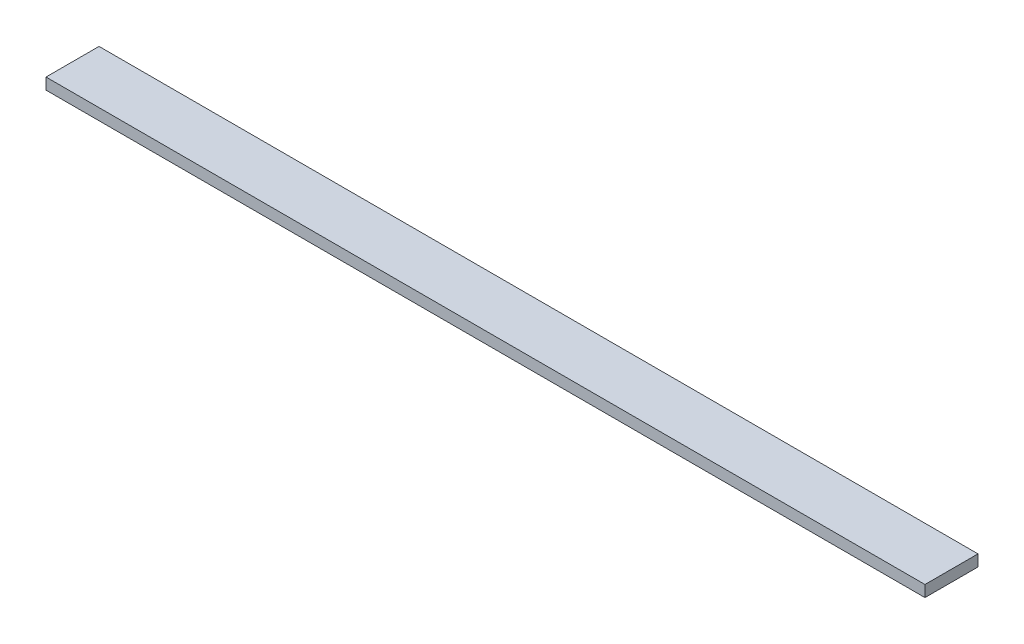
ISO-10303-21;
HEADER;
FILE_DESCRIPTION(('STEP AP214'),'2;1');
FILE_NAME('part.step','',(''),(''),'','','');
FILE_SCHEMA(('AUTOMOTIVE_DESIGN { 1 0 10303 214 1 1 1 1 }'));
ENDSEC;
DATA;
#1=APPLICATION_CONTEXT('core data for automotive mechanical design processes');
#2=APPLICATION_PROTOCOL_DEFINITION('international standard','automotive_design',2000,#1);
#3=PRODUCT_CONTEXT('',#1,'mechanical');
#4=PRODUCT('Part','Part','',(#3));
#5=PRODUCT_RELATED_PRODUCT_CATEGORY('part','',(#4));
#6=PRODUCT_DEFINITION_FORMATION('','',#4);
#7=PRODUCT_DEFINITION_CONTEXT('part definition',#1,'design');
#8=PRODUCT_DEFINITION('design','',#6,#7);
#9=PRODUCT_DEFINITION_SHAPE('','',#8);
#10=(LENGTH_UNIT() NAMED_UNIT(*) SI_UNIT(.MILLI.,.METRE.));
#11=(NAMED_UNIT(*) PLANE_ANGLE_UNIT() SI_UNIT($,.RADIAN.));
#12=(NAMED_UNIT(*) SI_UNIT($,.STERADIAN.) SOLID_ANGLE_UNIT());
#13=UNCERTAINTY_MEASURE_WITH_UNIT(LENGTH_MEASURE(1.E-05),#10,'distance_accuracy_value','');
#14=(GEOMETRIC_REPRESENTATION_CONTEXT(3) GLOBAL_UNCERTAINTY_ASSIGNED_CONTEXT((#13)) GLOBAL_UNIT_ASSIGNED_CONTEXT((#10,
#11,#12)) REPRESENTATION_CONTEXT('',''));
#15=CARTESIAN_POINT('',(0.,0.,0.));
#16=DIRECTION('',(0.,0.,1.));
#17=DIRECTION('',(1.,0.,0.));
#18=AXIS2_PLACEMENT_3D('',#15,#16,#17);
#19=CARTESIAN_POINT('',(60.,140.,-248.));
#20=DIRECTION('',(-1.,0.,0.));
#21=DIRECTION('',(0.,0.,1.));
#22=AXIS2_PLACEMENT_3D('',#19,#20,#21);
#23=PLANE('',#22);
#24=DIRECTION('',(0.,-1.,0.));
#25=VECTOR('',#24,1.);
#26=CARTESIAN_POINT('',(60.,140.,-213.));
#27=LINE('',#26,#25);
#28=CARTESIAN_POINT('',(60.,147.5,-213.));
#29=VERTEX_POINT('',#28);
#30=CARTESIAN_POINT('',(60.,140.,-213.));
#31=VERTEX_POINT('',#30);
#32=EDGE_CURVE('E103',#29,#31,#27,.T.);
#33=ORIENTED_EDGE('',*,*,#32,.F.);
#34=DIRECTION('',(0.,0.,1.));
#35=VECTOR('',#34,1.);
#36=CARTESIAN_POINT('',(60.,147.5,-248.));
#37=LINE('',#36,#35);
#38=CARTESIAN_POINT('',(60.,147.5,-248.));
#39=VERTEX_POINT('',#38);
#40=EDGE_CURVE('E11',#39,#29,#37,.T.);
#41=ORIENTED_EDGE('',*,*,#40,.F.);
#42=DIRECTION('',(0.,-1.,0.));
#43=VECTOR('',#42,1.);
#44=CARTESIAN_POINT('',(60.,140.,-248.));
#45=LINE('',#44,#43);
#46=CARTESIAN_POINT('',(60.,140.,-248.));
#47=VERTEX_POINT('',#46);
#48=EDGE_CURVE('E97',#39,#47,#45,.T.);
#49=ORIENTED_EDGE('',*,*,#48,.T.);
#50=DIRECTION('',(0.,0.,1.));
#51=VECTOR('',#50,1.);
#52=CARTESIAN_POINT('',(60.,140.,-248.));
#53=LINE('',#52,#51);
#54=EDGE_CURVE('E42',#47,#31,#53,.T.);
#55=ORIENTED_EDGE('',*,*,#54,.T.);
#56=EDGE_LOOP('',(#33,#41,#49,#55));
#57=FACE_BOUND('',#56,.T.);
#58=ADVANCED_FACE('F39',(#57),#23,.T.);
#59=CARTESIAN_POINT('',(60.,147.5,-248.));
#60=DIRECTION('',(0.,1.,0.));
#61=DIRECTION('',(0.,0.,1.));
#62=AXIS2_PLACEMENT_3D('',#59,#60,#61);
#63=PLANE('',#62);
#64=DIRECTION('',(-1.,0.,0.));
#65=VECTOR('',#64,1.);
#66=CARTESIAN_POINT('',(60.,147.5,-213.));
#67=LINE('',#66,#65);
#68=CARTESIAN_POINT('',(640.,147.5,-213.));
#69=VERTEX_POINT('',#68);
#70=EDGE_CURVE('E99',#69,#29,#67,.T.);
#71=ORIENTED_EDGE('',*,*,#70,.F.);
#72=DIRECTION('',(0.,0.,1.));
#73=VECTOR('',#72,1.);
#74=CARTESIAN_POINT('',(640.,147.5,-248.));
#75=LINE('',#74,#73);
#76=CARTESIAN_POINT('',(640.,147.5,-248.));
#77=VERTEX_POINT('',#76);
#78=EDGE_CURVE('E48',#77,#69,#75,.T.);
#79=ORIENTED_EDGE('',*,*,#78,.F.);
#80=DIRECTION('',(-1.,0.,0.));
#81=VECTOR('',#80,1.);
#82=CARTESIAN_POINT('',(60.,147.5,-248.));
#83=LINE('',#82,#81);
#84=EDGE_CURVE('E94',#77,#39,#83,.T.);
#85=ORIENTED_EDGE('',*,*,#84,.T.);
#86=ORIENTED_EDGE('',*,*,#40,.T.);
#87=EDGE_LOOP('',(#71,#79,#85,#86));
#88=FACE_BOUND('',#87,.T.);
#89=ADVANCED_FACE('F113',(#88),#63,.T.);
#90=CARTESIAN_POINT('',(640.,140.,-248.));
#91=DIRECTION('',(1.,0.,0.));
#92=DIRECTION('',(0.,0.,-1.));
#93=AXIS2_PLACEMENT_3D('',#90,#91,#92);
#94=PLANE('',#93);
#95=DIRECTION('',(0.,1.,0.));
#96=VECTOR('',#95,1.);
#97=CARTESIAN_POINT('',(640.,140.,-213.));
#98=LINE('',#97,#96);
#99=CARTESIAN_POINT('',(640.,140.,-213.));
#100=VERTEX_POINT('',#99);
#101=EDGE_CURVE('E89',#100,#69,#98,.T.);
#102=ORIENTED_EDGE('',*,*,#101,.F.);
#103=DIRECTION('',(0.,0.,1.));
#104=VECTOR('',#103,1.);
#105=CARTESIAN_POINT('',(640.,140.,-248.));
#106=LINE('',#105,#104);
#107=CARTESIAN_POINT('',(640.,140.,-248.));
#108=VERTEX_POINT('',#107);
#109=EDGE_CURVE('E84',#108,#100,#106,.T.);
#110=ORIENTED_EDGE('',*,*,#109,.F.);
#111=DIRECTION('',(0.,1.,0.));
#112=VECTOR('',#111,1.);
#113=CARTESIAN_POINT('',(640.,140.,-248.));
#114=LINE('',#113,#112);
#115=EDGE_CURVE('E87',#108,#77,#114,.T.);
#116=ORIENTED_EDGE('',*,*,#115,.T.);
#117=ORIENTED_EDGE('',*,*,#78,.T.);
#118=EDGE_LOOP('',(#102,#110,#116,#117));
#119=FACE_BOUND('',#118,.T.);
#120=ADVANCED_FACE('F86',(#119),#94,.T.);
#121=CARTESIAN_POINT('',(60.,140.,-248.));
#122=DIRECTION('',(0.,-1.,0.));
#123=DIRECTION('',(0.,0.,-1.));
#124=AXIS2_PLACEMENT_3D('',#121,#122,#123);
#125=PLANE('',#124);
#126=DIRECTION('',(1.,0.,0.));
#127=VECTOR('',#126,1.);
#128=CARTESIAN_POINT('',(60.,140.,-213.));
#129=LINE('',#128,#127);
#130=EDGE_CURVE('E106',#31,#100,#129,.T.);
#131=ORIENTED_EDGE('',*,*,#130,.F.);
#132=ORIENTED_EDGE('',*,*,#54,.F.);
#133=DIRECTION('',(1.,0.,0.));
#134=VECTOR('',#133,1.);
#135=CARTESIAN_POINT('',(60.,140.,-248.));
#136=LINE('',#135,#134);
#137=EDGE_CURVE('E93',#47,#108,#136,.T.);
#138=ORIENTED_EDGE('',*,*,#137,.T.);
#139=ORIENTED_EDGE('',*,*,#109,.T.);
#140=EDGE_LOOP('',(#131,#132,#138,#139));
#141=FACE_BOUND('',#140,.T.);
#142=ADVANCED_FACE('F96',(#141),#125,.T.);
#143=CARTESIAN_POINT('',(0.,0.,-248.));
#144=DIRECTION('',(0.,0.,-1.));
#145=DIRECTION('',(-1.,0.,0.));
#146=AXIS2_PLACEMENT_3D('',#143,#144,#145);
#147=PLANE('',#146);
#148=ORIENTED_EDGE('',*,*,#48,.F.);
#149=ORIENTED_EDGE('',*,*,#84,.F.);
#150=ORIENTED_EDGE('',*,*,#115,.F.);
#151=ORIENTED_EDGE('',*,*,#137,.F.);
#152=EDGE_LOOP('',(#148,#149,#150,#151));
#153=FACE_BOUND('',#152,.T.);
#154=ADVANCED_FACE('F92',(#153),#147,.T.);
#155=CARTESIAN_POINT('',(0.,0.,-213.));
#156=DIRECTION('',(0.,0.,-1.));
#157=DIRECTION('',(-1.,0.,0.));
#158=AXIS2_PLACEMENT_3D('',#155,#156,#157);
#159=PLANE('',#158);
#160=ORIENTED_EDGE('',*,*,#32,.T.);
#161=ORIENTED_EDGE('',*,*,#130,.T.);
#162=ORIENTED_EDGE('',*,*,#101,.T.);
#163=ORIENTED_EDGE('',*,*,#70,.T.);
#164=EDGE_LOOP('',(#160,#161,#162,#163));
#165=FACE_BOUND('',#164,.T.);
#166=ADVANCED_FACE('F112',(#165),#159,.F.);
#167=CLOSED_SHELL('',(#58,#89,#120,#142,#154,#166));
#168=MANIFOLD_SOLID_BREP('B2',#167);
#169=ADVANCED_BREP_SHAPE_REPRESENTATION('',(#18,#168),#14);
#170=SHAPE_DEFINITION_REPRESENTATION(#9,#169);
ENDSEC;
END-ISO-10303-21;
